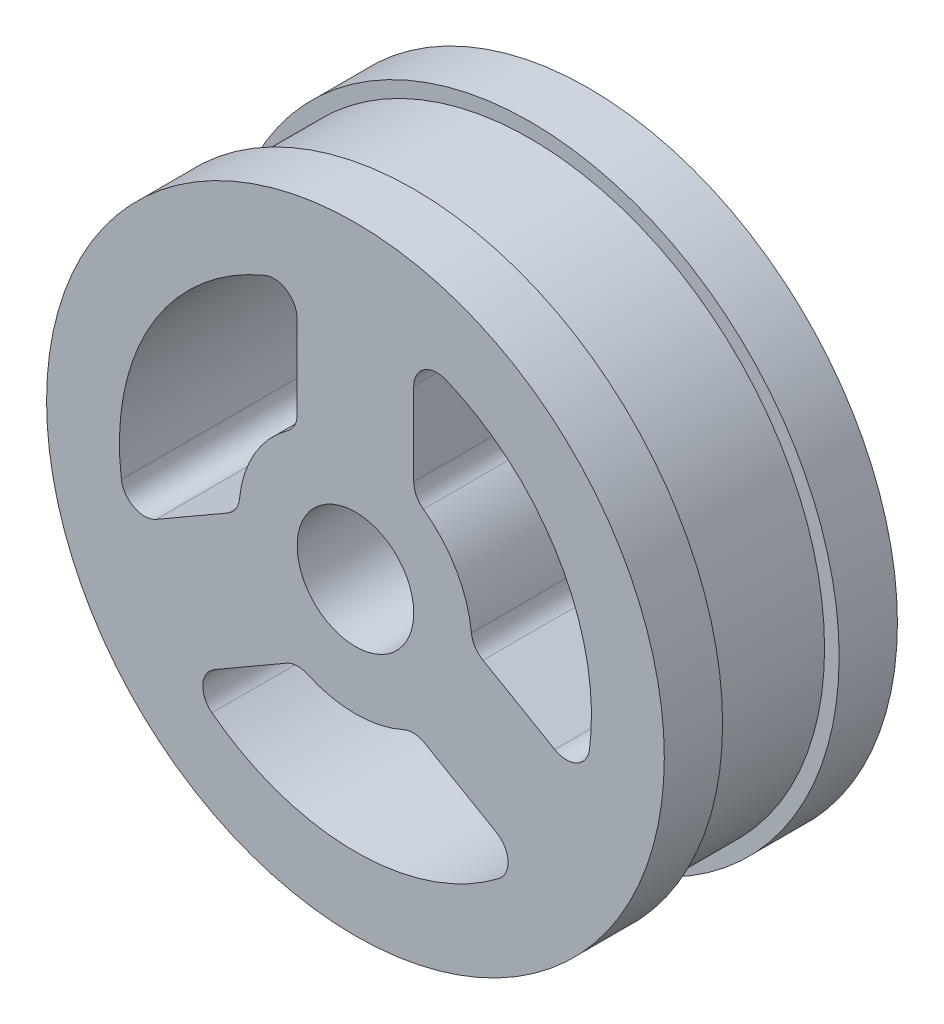
ISO-10303-21;
HEADER;
FILE_DESCRIPTION(('STEP AP214'),'2;1');
FILE_NAME('part.step','',(''),(''),'','','');
FILE_SCHEMA(('AUTOMOTIVE_DESIGN { 1 0 10303 214 1 1 1 1 }'));
ENDSEC;
DATA;
#1=APPLICATION_CONTEXT('core data for automotive mechanical design processes');
#2=APPLICATION_PROTOCOL_DEFINITION('international standard','automotive_design',2000,#1);
#3=PRODUCT_CONTEXT('',#1,'mechanical');
#4=PRODUCT('Part','Part','',(#3));
#5=PRODUCT_RELATED_PRODUCT_CATEGORY('part','',(#4));
#6=PRODUCT_DEFINITION_FORMATION('','',#4);
#7=PRODUCT_DEFINITION_CONTEXT('part definition',#1,'design');
#8=PRODUCT_DEFINITION('design','',#6,#7);
#9=PRODUCT_DEFINITION_SHAPE('','',#8);
#10=(LENGTH_UNIT() NAMED_UNIT(*) SI_UNIT(.MILLI.,.METRE.));
#11=(NAMED_UNIT(*) PLANE_ANGLE_UNIT() SI_UNIT($,.RADIAN.));
#12=(NAMED_UNIT(*) SI_UNIT($,.STERADIAN.) SOLID_ANGLE_UNIT());
#13=UNCERTAINTY_MEASURE_WITH_UNIT(LENGTH_MEASURE(1.E-05),#10,'distance_accuracy_value','');
#14=(GEOMETRIC_REPRESENTATION_CONTEXT(3) GLOBAL_UNCERTAINTY_ASSIGNED_CONTEXT((#13)) GLOBAL_UNIT_ASSIGNED_CONTEXT((#10,
#11,#12)) REPRESENTATION_CONTEXT('',''));
#15=CARTESIAN_POINT('',(0.,0.,0.));
#16=DIRECTION('',(0.,0.,1.));
#17=DIRECTION('',(1.,0.,0.));
#18=AXIS2_PLACEMENT_3D('',#15,#16,#17);
#19=CARTESIAN_POINT('',(0.,0.,0.));
#20=DIRECTION('',(0.,0.,1.));
#21=DIRECTION('',(1.,0.,0.));
#22=AXIS2_PLACEMENT_3D('',#19,#20,#21);
#23=PLANE('',#22);
#24=CARTESIAN_POINT('',(0.,0.,0.));
#25=DIRECTION('',(0.,0.,1.));
#26=DIRECTION('',(1.,0.,0.));
#27=AXIS2_PLACEMENT_3D('',#24,#25,#26);
#28=CIRCLE('',#27,10.);
#29=CARTESIAN_POINT('',(-4.11747625672221,-9.11297916574645,0.));
#30=VERTEX_POINT('',#29);
#31=CARTESIAN_POINT('',(4.11747625672323,-9.11297916574599,0.));
#32=VERTEX_POINT('',#31);
#33=EDGE_CURVE('E226',#30,#32,#28,.T.);
#34=ORIENTED_EDGE('',*,*,#33,.F.);
#35=CARTESIAN_POINT('',(-4.94097150806665,-10.9355749988957,0.));
#36=DIRECTION('',(0.,0.,1.));
#37=DIRECTION('',(1.,0.,0.));
#38=AXIS2_PLACEMENT_3D('',#35,#36,#37);
#39=CIRCLE('',#38,2.);
#40=CARTESIAN_POINT('',(-5.94097150806665,-9.20352419132686,0.));
#41=VERTEX_POINT('',#40);
#42=EDGE_CURVE('E335',#30,#41,#39,.T.);
#43=ORIENTED_EDGE('',*,*,#42,.T.);
#44=DIRECTION('',(-0.866025403784438,-0.5,0.));
#45=VECTOR('',#44,1.);
#46=CARTESIAN_POINT('',(2.50000000000018,-4.33012701892251,0.));
#47=LINE('',#46,#45);
#48=CARTESIAN_POINT('',(-12.0961253420211,-12.757203914264,0.));
#49=VERTEX_POINT('',#48);
#50=EDGE_CURVE('E660',#41,#49,#47,.T.);
#51=ORIENTED_EDGE('',*,*,#50,.T.);
#52=CARTESIAN_POINT('',(-11.0961253420211,-14.4892547218329,0.));
#53=DIRECTION('',(0.,0.,1.));
#54=DIRECTION('',(1.,0.,0.));
#55=AXIS2_PLACEMENT_3D('',#52,#53,#54);
#56=CIRCLE('',#55,2.);
#57=CARTESIAN_POINT('',(-12.312139078133,-16.0771182529927,0.));
#58=VERTEX_POINT('',#57);
#59=EDGE_CURVE('E215',#49,#58,#56,.T.);
#60=ORIENTED_EDGE('',*,*,#59,.T.);
#61=CARTESIAN_POINT('',(0.,0.,0.));
#62=DIRECTION('',(0.,0.,1.));
#63=DIRECTION('',(1.,0.,0.));
#64=AXIS2_PLACEMENT_3D('',#61,#62,#63);
#65=CIRCLE('',#64,20.25);
#66=CARTESIAN_POINT('',(12.3121390781341,-16.0771182529919,0.));
#67=VERTEX_POINT('',#66);
#68=EDGE_CURVE('E656',#58,#67,#65,.T.);
#69=ORIENTED_EDGE('',*,*,#68,.T.);
#70=CARTESIAN_POINT('',(11.0961253420221,-14.4892547218322,0.));
#71=DIRECTION('',(0.,0.,1.));
#72=DIRECTION('',(1.,0.,0.));
#73=AXIS2_PLACEMENT_3D('',#70,#71,#72);
#74=CIRCLE('',#73,2.);
#75=CARTESIAN_POINT('',(12.0961253420221,-12.7572039142633,0.));
#76=VERTEX_POINT('',#75);
#77=EDGE_CURVE('E322',#67,#76,#74,.T.);
#78=ORIENTED_EDGE('',*,*,#77,.T.);
#79=DIRECTION('',(0.866025403784439,-0.5,0.));
#80=VECTOR('',#79,1.);
#81=CARTESIAN_POINT('',(-2.49999999999964,-4.33012701892157,0.));
#82=LINE('',#81,#80);
#83=CARTESIAN_POINT('',(5.94097150806788,-9.20352419132631,0.));
#84=VERTEX_POINT('',#83);
#85=EDGE_CURVE('E422',#84,#76,#82,.T.);
#86=ORIENTED_EDGE('',*,*,#85,.F.);
#87=CARTESIAN_POINT('',(4.94097150806788,-10.9355749988952,0.));
#88=DIRECTION('',(0.,0.,1.));
#89=DIRECTION('',(1.,0.,0.));
#90=AXIS2_PLACEMENT_3D('',#87,#88,#89);
#91=CIRCLE('',#90,2.);
#92=EDGE_CURVE('E214',#84,#32,#91,.T.);
#93=ORIENTED_EDGE('',*,*,#92,.T.);
#94=EDGE_LOOP('',(#34,#43,#51,#60,#69,#78,#86,#93));
#95=FACE_BOUND('',#94,.T.);
#96=CARTESIAN_POINT('',(0.,0.,0.));
#97=DIRECTION('',(0.,0.,1.));
#98=DIRECTION('',(1.,0.,0.));
#99=AXIS2_PLACEMENT_3D('',#96,#97,#98);
#100=CIRCLE('',#99,26.5);
#101=CARTESIAN_POINT('',(26.5,0.,0.));
#102=VERTEX_POINT('',#101);
#103=EDGE_CURVE('E242',#102,#102,#100,.T.);
#104=ORIENTED_EDGE('',*,*,#103,.F.);
#105=EDGE_LOOP('',(#104));
#106=FACE_BOUND('',#105,.T.);
#107=CARTESIAN_POINT('',(0.,0.,0.));
#108=DIRECTION('',(0.,0.,1.));
#109=DIRECTION('',(1.,0.,0.));
#110=AXIS2_PLACEMENT_3D('',#107,#108,#109);
#111=CIRCLE('',#110,5.);
#112=CARTESIAN_POINT('',(5.,0.,0.));
#113=VERTEX_POINT('',#112);
#114=EDGE_CURVE('E430',#113,#113,#111,.T.);
#115=ORIENTED_EDGE('',*,*,#114,.T.);
#116=EDGE_LOOP('',(#115));
#117=FACE_BOUND('',#116,.T.);
#118=CARTESIAN_POINT('',(0.,0.,0.));
#119=DIRECTION('',(0.,0.,1.));
#120=DIRECTION('',(1.,0.,0.));
#121=AXIS2_PLACEMENT_3D('',#118,#119,#120);
#122=CIRCLE('',#121,10.);
#123=CARTESIAN_POINT('',(-5.83333333333333,8.12232862067414,0.));
#124=VERTEX_POINT('',#123);
#125=CARTESIAN_POINT('',(-9.95080959005593,0.990650545071783,0.));
#126=VERTEX_POINT('',#125);
#127=EDGE_CURVE('E416',#124,#126,#122,.T.);
#128=ORIENTED_EDGE('',*,*,#127,.F.);
#129=CARTESIAN_POINT('',(-7.,9.74679434480896,0.));
#130=DIRECTION('',(0.,0.,1.));
#131=DIRECTION('',(1.,0.,0.));
#132=AXIS2_PLACEMENT_3D('',#129,#130,#131);
#133=CIRCLE('',#132,2.);
#134=CARTESIAN_POINT('',(-5.,9.74679434480896,0.));
#135=VERTEX_POINT('',#134);
#136=EDGE_CURVE('E353',#124,#135,#133,.T.);
#137=ORIENTED_EDGE('',*,*,#136,.T.);
#138=DIRECTION('',(0.,1.,0.));
#139=VECTOR('',#138,1.);
#140=CARTESIAN_POINT('',(-5.,0.,0.));
#141=LINE('',#140,#139);
#142=CARTESIAN_POINT('',(-5.,16.8541537906832,0.));
#143=VERTEX_POINT('',#142);
#144=EDGE_CURVE('E404',#135,#143,#141,.T.);
#145=ORIENTED_EDGE('',*,*,#144,.T.);
#146=CARTESIAN_POINT('',(-7.,16.8541537906832,0.));
#147=DIRECTION('',(0.,0.,1.));
#148=DIRECTION('',(1.,0.,0.));
#149=AXIS2_PLACEMENT_3D('',#146,#147,#148);
#150=CIRCLE('',#149,2.);
#151=CARTESIAN_POINT('',(-7.76712328767123,18.7011843430868,0.));
#152=VERTEX_POINT('',#151);
#153=EDGE_CURVE('E11',#143,#152,#150,.T.);
#154=ORIENTED_EDGE('',*,*,#153,.T.);
#155=CARTESIAN_POINT('',(0.,0.,0.));
#156=DIRECTION('',(0.,0.,1.));
#157=DIRECTION('',(1.,0.,0.));
#158=AXIS2_PLACEMENT_3D('',#155,#156,#157);
#159=CIRCLE('',#158,20.25);
#160=CARTESIAN_POINT('',(-20.0792623658045,-2.62406609009485,0.));
#161=VERTEX_POINT('',#160);
#162=EDGE_CURVE('E402',#152,#161,#159,.T.);
#163=ORIENTED_EDGE('',*,*,#162,.T.);
#164=CARTESIAN_POINT('',(-18.0961253420214,-2.36489906885091,0.));
#165=DIRECTION('',(0.,0.,1.));
#166=DIRECTION('',(1.,0.,0.));
#167=AXIS2_PLACEMENT_3D('',#164,#165,#166);
#168=CIRCLE('',#167,2.);
#169=CARTESIAN_POINT('',(-17.0961253420214,-4.09694987641979,0.));
#170=VERTEX_POINT('',#169);
#171=EDGE_CURVE('E341',#161,#170,#168,.T.);
#172=ORIENTED_EDGE('',*,*,#171,.T.);
#173=DIRECTION('',(-0.866025403784438,-0.5,0.));
#174=VECTOR('',#173,1.);
#175=CARTESIAN_POINT('',(-2.49999999999982,4.33012701892188,0.));
#176=LINE('',#175,#174);
#177=CARTESIAN_POINT('',(-10.9409715080671,-0.543270153482737,0.));
#178=VERTEX_POINT('',#177);
#179=EDGE_CURVE('E409',#178,#170,#176,.T.);
#180=ORIENTED_EDGE('',*,*,#179,.F.);
#181=CARTESIAN_POINT('',(-11.9409715080671,1.18878065408614,0.));
#182=DIRECTION('',(0.,0.,1.));
#183=DIRECTION('',(1.,0.,0.));
#184=AXIS2_PLACEMENT_3D('',#181,#182,#183);
#185=CIRCLE('',#184,2.);
#186=EDGE_CURVE('E347',#178,#126,#185,.T.);
#187=ORIENTED_EDGE('',*,*,#186,.T.);
#188=EDGE_LOOP('',(#128,#137,#145,#154,#163,#172,#180,#187));
#189=FACE_BOUND('',#188,.T.);
#190=CARTESIAN_POINT('',(0.,0.,0.));
#191=DIRECTION('',(0.,0.,1.));
#192=DIRECTION('',(1.,0.,0.));
#193=AXIS2_PLACEMENT_3D('',#190,#191,#192);
#194=CIRCLE('',#193,10.);
#195=CARTESIAN_POINT('',(9.95080959005582,0.990650545072899,0.));
#196=VERTEX_POINT('',#195);
#197=CARTESIAN_POINT('',(5.83333333333333,8.12232862067414,0.));
#198=VERTEX_POINT('',#197);
#199=EDGE_CURVE('E566',#196,#198,#194,.T.);
#200=ORIENTED_EDGE('',*,*,#199,.F.);
#201=CARTESIAN_POINT('',(11.940971508067,1.18878065408748,0.));
#202=DIRECTION('',(0.,0.,1.));
#203=DIRECTION('',(1.,0.,0.));
#204=AXIS2_PLACEMENT_3D('',#201,#202,#203);
#205=CIRCLE('',#204,2.);
#206=CARTESIAN_POINT('',(10.940971508067,-0.5432701534814,0.));
#207=VERTEX_POINT('',#206);
#208=EDGE_CURVE('E365',#196,#207,#205,.T.);
#209=ORIENTED_EDGE('',*,*,#208,.T.);
#210=DIRECTION('',(0.866025403784439,-0.5,0.));
#211=VECTOR('',#210,1.);
#212=CARTESIAN_POINT('',(2.50000000000036,4.33012701892282,0.));
#213=LINE('',#212,#211);
#214=CARTESIAN_POINT('',(17.0961253420215,-4.09694987641861,0.));
#215=VERTEX_POINT('',#214);
#216=EDGE_CURVE('E553',#207,#215,#213,.T.);
#217=ORIENTED_EDGE('',*,*,#216,.T.);
#218=CARTESIAN_POINT('',(18.0961253420215,-2.36489906884974,0.));
#219=DIRECTION('',(0.,0.,1.));
#220=DIRECTION('',(1.,0.,0.));
#221=AXIS2_PLACEMENT_3D('',#218,#219,#220);
#222=CIRCLE('',#221,2.);
#223=CARTESIAN_POINT('',(20.0792623658047,-2.62406609009354,0.));
#224=VERTEX_POINT('',#223);
#225=EDGE_CURVE('E376',#215,#224,#222,.T.);
#226=ORIENTED_EDGE('',*,*,#225,.T.);
#227=CARTESIAN_POINT('',(0.,0.,0.));
#228=DIRECTION('',(0.,0.,1.));
#229=DIRECTION('',(1.,0.,0.));
#230=AXIS2_PLACEMENT_3D('',#227,#228,#229);
#231=CIRCLE('',#230,20.25);
#232=CARTESIAN_POINT('',(7.76712328767123,18.7011843430868,0.));
#233=VERTEX_POINT('',#232);
#234=EDGE_CURVE('E550',#224,#233,#231,.T.);
#235=ORIENTED_EDGE('',*,*,#234,.T.);
#236=CARTESIAN_POINT('',(7.,16.8541537906832,0.));
#237=DIRECTION('',(0.,0.,1.));
#238=DIRECTION('',(1.,0.,0.));
#239=AXIS2_PLACEMENT_3D('',#236,#237,#238);
#240=CIRCLE('',#239,2.);
#241=CARTESIAN_POINT('',(5.,16.8541537906832,0.));
#242=VERTEX_POINT('',#241);
#243=EDGE_CURVE('E359',#233,#242,#240,.T.);
#244=ORIENTED_EDGE('',*,*,#243,.T.);
#245=DIRECTION('',(0.,1.,0.));
#246=VECTOR('',#245,1.);
#247=CARTESIAN_POINT('',(5.,0.,0.));
#248=LINE('',#247,#246);
#249=CARTESIAN_POINT('',(5.,9.74679434480896,0.));
#250=VERTEX_POINT('',#249);
#251=EDGE_CURVE('E560',#250,#242,#248,.T.);
#252=ORIENTED_EDGE('',*,*,#251,.F.);
#253=CARTESIAN_POINT('',(7.,9.74679434480896,0.));
#254=DIRECTION('',(0.,0.,1.));
#255=DIRECTION('',(1.,0.,0.));
#256=AXIS2_PLACEMENT_3D('',#253,#254,#255);
#257=CIRCLE('',#256,2.);
#258=EDGE_CURVE('E54',#250,#198,#257,.T.);
#259=ORIENTED_EDGE('',*,*,#258,.T.);
#260=EDGE_LOOP('',(#200,#209,#217,#226,#235,#244,#252,#259));
#261=FACE_BOUND('',#260,.T.);
#262=ADVANCED_FACE('F38',(#95,#106,#117,#189,#261),#23,.F.);
#263=CARTESIAN_POINT('',(0.,0.,20.));
#264=DIRECTION('',(0.,0.,1.));
#265=DIRECTION('',(1.,0.,0.));
#266=AXIS2_PLACEMENT_3D('',#263,#264,#265);
#267=PLANE('',#266);
#268=CARTESIAN_POINT('',(0.,0.,20.));
#269=DIRECTION('',(0.,0.,1.));
#270=DIRECTION('',(1.,0.,0.));
#271=AXIS2_PLACEMENT_3D('',#268,#269,#270);
#272=CIRCLE('',#271,5.);
#273=CARTESIAN_POINT('',(5.,0.,20.));
#274=VERTEX_POINT('',#273);
#275=EDGE_CURVE('E414',#274,#274,#272,.T.);
#276=ORIENTED_EDGE('',*,*,#275,.F.);
#277=EDGE_LOOP('',(#276));
#278=FACE_BOUND('',#277,.T.);
#279=CARTESIAN_POINT('',(0.,0.,20.));
#280=DIRECTION('',(0.,0.,1.));
#281=DIRECTION('',(1.,0.,0.));
#282=AXIS2_PLACEMENT_3D('',#279,#280,#281);
#283=CIRCLE('',#282,26.5);
#284=CARTESIAN_POINT('',(26.5,0.,20.));
#285=VERTEX_POINT('',#284);
#286=EDGE_CURVE('E438',#285,#285,#283,.T.);
#287=ORIENTED_EDGE('',*,*,#286,.T.);
#288=EDGE_LOOP('',(#287));
#289=FACE_BOUND('',#288,.T.);
#290=DIRECTION('',(0.,1.,0.));
#291=VECTOR('',#290,1.);
#292=CARTESIAN_POINT('',(-5.,0.,20.));
#293=LINE('',#292,#291);
#294=CARTESIAN_POINT('',(-5.,9.74679434480896,20.));
#295=VERTEX_POINT('',#294);
#296=CARTESIAN_POINT('',(-5.,16.8541537906832,20.));
#297=VERTEX_POINT('',#296);
#298=EDGE_CURVE('E383',#295,#297,#293,.T.);
#299=ORIENTED_EDGE('',*,*,#298,.F.);
#300=CARTESIAN_POINT('',(-7.,9.74679434480896,20.));
#301=DIRECTION('',(0.,0.,1.));
#302=DIRECTION('',(1.,0.,0.));
#303=AXIS2_PLACEMENT_3D('',#300,#301,#302);
#304=CIRCLE('',#303,2.);
#305=CARTESIAN_POINT('',(-5.83333333333333,8.12232862067414,20.));
#306=VERTEX_POINT('',#305);
#307=EDGE_CURVE('E350',#295,#306,#304,.F.);
#308=ORIENTED_EDGE('',*,*,#307,.T.);
#309=CARTESIAN_POINT('',(0.,0.,20.));
#310=DIRECTION('',(0.,0.,1.));
#311=DIRECTION('',(1.,0.,0.));
#312=AXIS2_PLACEMENT_3D('',#309,#310,#311);
#313=CIRCLE('',#312,10.);
#314=CARTESIAN_POINT('',(-9.95080959005593,0.990650545071783,20.));
#315=VERTEX_POINT('',#314);
#316=EDGE_CURVE('E395',#306,#315,#313,.T.);
#317=ORIENTED_EDGE('',*,*,#316,.T.);
#318=CARTESIAN_POINT('',(-11.9409715080671,1.18878065408614,20.));
#319=DIRECTION('',(0.,0.,1.));
#320=DIRECTION('',(1.,0.,0.));
#321=AXIS2_PLACEMENT_3D('',#318,#319,#320);
#322=CIRCLE('',#321,2.);
#323=CARTESIAN_POINT('',(-10.9409715080671,-0.543270153482737,20.));
#324=VERTEX_POINT('',#323);
#325=EDGE_CURVE('E344',#315,#324,#322,.F.);
#326=ORIENTED_EDGE('',*,*,#325,.T.);
#327=DIRECTION('',(-0.866025403784438,-0.5,0.));
#328=VECTOR('',#327,1.);
#329=CARTESIAN_POINT('',(-2.49999999999982,4.33012701892188,20.));
#330=LINE('',#329,#328);
#331=CARTESIAN_POINT('',(-17.0961253420214,-4.09694987641979,20.));
#332=VERTEX_POINT('',#331);
#333=EDGE_CURVE('E426',#324,#332,#330,.T.);
#334=ORIENTED_EDGE('',*,*,#333,.T.);
#335=CARTESIAN_POINT('',(-18.0961253420214,-2.36489906885091,20.));
#336=DIRECTION('',(0.,0.,1.));
#337=DIRECTION('',(1.,0.,0.));
#338=AXIS2_PLACEMENT_3D('',#335,#336,#337);
#339=CIRCLE('',#338,2.);
#340=CARTESIAN_POINT('',(-20.0792623658045,-2.62406609009485,20.));
#341=VERTEX_POINT('',#340);
#342=EDGE_CURVE('E338',#332,#341,#339,.F.);
#343=ORIENTED_EDGE('',*,*,#342,.T.);
#344=CARTESIAN_POINT('',(0.,0.,20.));
#345=DIRECTION('',(0.,0.,1.));
#346=DIRECTION('',(1.,0.,0.));
#347=AXIS2_PLACEMENT_3D('',#344,#345,#346);
#348=CIRCLE('',#347,20.25);
#349=CARTESIAN_POINT('',(-7.76712328767123,18.7011843430868,20.));
#350=VERTEX_POINT('',#349);
#351=EDGE_CURVE('E385',#350,#341,#348,.T.);
#352=ORIENTED_EDGE('',*,*,#351,.F.);
#353=CARTESIAN_POINT('',(-7.,16.8541537906832,20.));
#354=DIRECTION('',(0.,0.,1.));
#355=DIRECTION('',(1.,0.,0.));
#356=AXIS2_PLACEMENT_3D('',#353,#354,#355);
#357=CIRCLE('',#356,2.);
#358=EDGE_CURVE('E47',#350,#297,#357,.F.);
#359=ORIENTED_EDGE('',*,*,#358,.T.);
#360=EDGE_LOOP('',(#299,#308,#317,#326,#334,#343,#352,#359));
#361=FACE_BOUND('',#360,.T.);
#362=DIRECTION('',(-0.866025403784438,-0.5,0.));
#363=VECTOR('',#362,1.);
#364=CARTESIAN_POINT('',(2.50000000000018,-4.33012701892251,20.));
#365=LINE('',#364,#363);
#366=CARTESIAN_POINT('',(-5.94097150806665,-9.20352419132686,20.));
#367=VERTEX_POINT('',#366);
#368=CARTESIAN_POINT('',(-12.0961253420211,-12.757203914264,20.));
#369=VERTEX_POINT('',#368);
#370=EDGE_CURVE('E648',#367,#369,#365,.T.);
#371=ORIENTED_EDGE('',*,*,#370,.F.);
#372=CARTESIAN_POINT('',(-4.94097150806665,-10.9355749988957,20.));
#373=DIRECTION('',(0.,0.,1.));
#374=DIRECTION('',(1.,0.,0.));
#375=AXIS2_PLACEMENT_3D('',#372,#373,#374);
#376=CIRCLE('',#375,2.);
#377=CARTESIAN_POINT('',(-4.11747625672221,-9.11297916574645,20.));
#378=VERTEX_POINT('',#377);
#379=EDGE_CURVE('E332',#367,#378,#376,.F.);
#380=ORIENTED_EDGE('',*,*,#379,.T.);
#381=CARTESIAN_POINT('',(0.,0.,20.));
#382=DIRECTION('',(0.,0.,1.));
#383=DIRECTION('',(1.,0.,0.));
#384=AXIS2_PLACEMENT_3D('',#381,#382,#383);
#385=CIRCLE('',#384,10.);
#386=CARTESIAN_POINT('',(4.11747625672323,-9.11297916574599,20.));
#387=VERTEX_POINT('',#386);
#388=EDGE_CURVE('E208',#378,#387,#385,.T.);
#389=ORIENTED_EDGE('',*,*,#388,.T.);
#390=CARTESIAN_POINT('',(4.94097150806788,-10.9355749988952,20.));
#391=DIRECTION('',(0.,0.,1.));
#392=DIRECTION('',(1.,0.,0.));
#393=AXIS2_PLACEMENT_3D('',#390,#391,#392);
#394=CIRCLE('',#393,2.);
#395=CARTESIAN_POINT('',(5.94097150806788,-9.20352419132631,20.));
#396=VERTEX_POINT('',#395);
#397=EDGE_CURVE('E201',#387,#396,#394,.F.);
#398=ORIENTED_EDGE('',*,*,#397,.T.);
#399=DIRECTION('',(0.866025403784439,-0.5,0.));
#400=VECTOR('',#399,1.);
#401=CARTESIAN_POINT('',(-2.49999999999964,-4.33012701892157,20.));
#402=LINE('',#401,#400);
#403=CARTESIAN_POINT('',(12.0961253420221,-12.7572039142633,20.));
#404=VERTEX_POINT('',#403);
#405=EDGE_CURVE('E206',#396,#404,#402,.T.);
#406=ORIENTED_EDGE('',*,*,#405,.T.);
#407=CARTESIAN_POINT('',(11.0961253420221,-14.4892547218322,20.));
#408=DIRECTION('',(0.,0.,1.));
#409=DIRECTION('',(1.,0.,0.));
#410=AXIS2_PLACEMENT_3D('',#407,#408,#409);
#411=CIRCLE('',#410,2.);
#412=CARTESIAN_POINT('',(12.3121390781341,-16.0771182529919,20.));
#413=VERTEX_POINT('',#412);
#414=EDGE_CURVE('E319',#404,#413,#411,.F.);
#415=ORIENTED_EDGE('',*,*,#414,.T.);
#416=CARTESIAN_POINT('',(0.,0.,20.));
#417=DIRECTION('',(0.,0.,1.));
#418=DIRECTION('',(1.,0.,0.));
#419=AXIS2_PLACEMENT_3D('',#416,#417,#418);
#420=CIRCLE('',#419,20.25);
#421=CARTESIAN_POINT('',(-12.312139078133,-16.0771182529927,20.));
#422=VERTEX_POINT('',#421);
#423=EDGE_CURVE('E227',#422,#413,#420,.T.);
#424=ORIENTED_EDGE('',*,*,#423,.F.);
#425=CARTESIAN_POINT('',(-11.0961253420211,-14.4892547218329,20.));
#426=DIRECTION('',(0.,0.,1.));
#427=DIRECTION('',(1.,0.,0.));
#428=AXIS2_PLACEMENT_3D('',#425,#426,#427);
#429=CIRCLE('',#428,2.);
#430=EDGE_CURVE('E325',#422,#369,#429,.F.);
#431=ORIENTED_EDGE('',*,*,#430,.T.);
#432=EDGE_LOOP('',(#371,#380,#389,#398,#406,#415,#424,#431));
#433=FACE_BOUND('',#432,.T.);
#434=DIRECTION('',(0.866025403784439,-0.5,0.));
#435=VECTOR('',#434,1.);
#436=CARTESIAN_POINT('',(2.50000000000036,4.33012701892282,20.));
#437=LINE('',#436,#435);
#438=CARTESIAN_POINT('',(10.940971508067,-0.5432701534814,20.));
#439=VERTEX_POINT('',#438);
#440=CARTESIAN_POINT('',(17.0961253420215,-4.09694987641861,20.));
#441=VERTEX_POINT('',#440);
#442=EDGE_CURVE('E574',#439,#441,#437,.T.);
#443=ORIENTED_EDGE('',*,*,#442,.F.);
#444=CARTESIAN_POINT('',(11.940971508067,1.18878065408748,20.));
#445=DIRECTION('',(0.,0.,1.));
#446=DIRECTION('',(1.,0.,0.));
#447=AXIS2_PLACEMENT_3D('',#444,#445,#446);
#448=CIRCLE('',#447,2.);
#449=CARTESIAN_POINT('',(9.95080959005582,0.990650545072899,20.));
#450=VERTEX_POINT('',#449);
#451=EDGE_CURVE('E362',#439,#450,#448,.F.);
#452=ORIENTED_EDGE('',*,*,#451,.T.);
#453=CARTESIAN_POINT('',(0.,0.,20.));
#454=DIRECTION('',(0.,0.,1.));
#455=DIRECTION('',(1.,0.,0.));
#456=AXIS2_PLACEMENT_3D('',#453,#454,#455);
#457=CIRCLE('',#456,10.);
#458=CARTESIAN_POINT('',(5.83333333333333,8.12232862067414,20.));
#459=VERTEX_POINT('',#458);
#460=EDGE_CURVE('E570',#450,#459,#457,.T.);
#461=ORIENTED_EDGE('',*,*,#460,.T.);
#462=CARTESIAN_POINT('',(7.,9.74679434480896,20.));
#463=DIRECTION('',(0.,0.,1.));
#464=DIRECTION('',(1.,0.,0.));
#465=AXIS2_PLACEMENT_3D('',#462,#463,#464);
#466=CIRCLE('',#465,2.);
#467=CARTESIAN_POINT('',(5.,9.74679434480896,20.));
#468=VERTEX_POINT('',#467);
#469=EDGE_CURVE('E368',#459,#468,#466,.F.);
#470=ORIENTED_EDGE('',*,*,#469,.T.);
#471=DIRECTION('',(0.,1.,0.));
#472=VECTOR('',#471,1.);
#473=CARTESIAN_POINT('',(5.,0.,20.));
#474=LINE('',#473,#472);
#475=CARTESIAN_POINT('',(5.,16.8541537906832,20.));
#476=VERTEX_POINT('',#475);
#477=EDGE_CURVE('E581',#468,#476,#474,.T.);
#478=ORIENTED_EDGE('',*,*,#477,.T.);
#479=CARTESIAN_POINT('',(7.,16.8541537906832,20.));
#480=DIRECTION('',(0.,0.,1.));
#481=DIRECTION('',(1.,0.,0.));
#482=AXIS2_PLACEMENT_3D('',#479,#480,#481);
#483=CIRCLE('',#482,2.);
#484=CARTESIAN_POINT('',(7.76712328767123,18.7011843430868,20.));
#485=VERTEX_POINT('',#484);
#486=EDGE_CURVE('E356',#476,#485,#483,.F.);
#487=ORIENTED_EDGE('',*,*,#486,.T.);
#488=CARTESIAN_POINT('',(0.,0.,20.));
#489=DIRECTION('',(0.,0.,1.));
#490=DIRECTION('',(1.,0.,0.));
#491=AXIS2_PLACEMENT_3D('',#488,#489,#490);
#492=CIRCLE('',#491,20.25);
#493=CARTESIAN_POINT('',(20.0792623658047,-2.62406609009354,20.));
#494=VERTEX_POINT('',#493);
#495=EDGE_CURVE('E578',#494,#485,#492,.T.);
#496=ORIENTED_EDGE('',*,*,#495,.F.);
#497=CARTESIAN_POINT('',(18.0961253420215,-2.36489906884974,20.));
#498=DIRECTION('',(0.,0.,1.));
#499=DIRECTION('',(1.,0.,0.));
#500=AXIS2_PLACEMENT_3D('',#497,#498,#499);
#501=CIRCLE('',#500,2.);
#502=EDGE_CURVE('E373',#494,#441,#501,.F.);
#503=ORIENTED_EDGE('',*,*,#502,.T.);
#504=EDGE_LOOP('',(#443,#452,#461,#470,#478,#487,#496,#503));
#505=FACE_BOUND('',#504,.T.);
#506=ADVANCED_FACE('F204',(#278,#289,#361,#433,#505),#267,.T.);
#507=CARTESIAN_POINT('',(0.,0.,5.));
#508=DIRECTION('',(0.,0.,-1.));
#509=DIRECTION('',(-1.,0.,0.));
#510=AXIS2_PLACEMENT_3D('',#507,#508,#509);
#511=CYLINDRICAL_SURFACE('',#510,26.5);
#512=CARTESIAN_POINT('',(0.,0.,5.));
#513=DIRECTION('',(0.,0.,1.));
#514=DIRECTION('',(1.,0.,0.));
#515=AXIS2_PLACEMENT_3D('',#512,#513,#514);
#516=CIRCLE('',#515,26.5);
#517=CARTESIAN_POINT('',(26.5,0.,5.));
#518=VERTEX_POINT('',#517);
#519=EDGE_CURVE('E239',#518,#518,#516,.T.);
#520=ORIENTED_EDGE('',*,*,#519,.F.);
#521=EDGE_LOOP('',(#520));
#522=FACE_BOUND('',#521,.T.);
#523=ORIENTED_EDGE('',*,*,#103,.T.);
#524=EDGE_LOOP('',(#523));
#525=FACE_BOUND('',#524,.T.);
#526=ADVANCED_FACE('F456',(#522,#525),#511,.T.);
#527=CARTESIAN_POINT('',(0.,0.,5.));
#528=DIRECTION('',(0.,0.,1.));
#529=DIRECTION('',(1.,0.,0.));
#530=AXIS2_PLACEMENT_3D('',#527,#528,#529);
#531=PLANE('',#530);
#532=CARTESIAN_POINT('',(0.,0.,5.));
#533=DIRECTION('',(0.,0.,1.));
#534=DIRECTION('',(1.,0.,0.));
#535=AXIS2_PLACEMENT_3D('',#532,#533,#534);
#536=CIRCLE('',#535,25.25);
#537=CARTESIAN_POINT('',(25.25,0.,5.));
#538=VERTEX_POINT('',#537);
#539=EDGE_CURVE('E232',#538,#538,#536,.T.);
#540=ORIENTED_EDGE('',*,*,#539,.F.);
#541=EDGE_LOOP('',(#540));
#542=FACE_BOUND('',#541,.T.);
#543=ORIENTED_EDGE('',*,*,#519,.T.);
#544=EDGE_LOOP('',(#543));
#545=FACE_BOUND('',#544,.T.);
#546=ADVANCED_FACE('F492',(#542,#545),#531,.T.);
#547=CARTESIAN_POINT('',(0.,0.,15.));
#548=DIRECTION('',(0.,0.,-1.));
#549=DIRECTION('',(-1.,0.,0.));
#550=AXIS2_PLACEMENT_3D('',#547,#548,#549);
#551=CYLINDRICAL_SURFACE('',#550,25.25);
#552=CARTESIAN_POINT('',(0.,0.,15.));
#553=DIRECTION('',(0.,0.,1.));
#554=DIRECTION('',(1.,0.,0.));
#555=AXIS2_PLACEMENT_3D('',#552,#553,#554);
#556=CIRCLE('',#555,25.25);
#557=CARTESIAN_POINT('',(25.25,0.,15.));
#558=VERTEX_POINT('',#557);
#559=EDGE_CURVE('E442',#558,#558,#556,.T.);
#560=ORIENTED_EDGE('',*,*,#559,.F.);
#561=EDGE_LOOP('',(#560));
#562=FACE_BOUND('',#561,.T.);
#563=ORIENTED_EDGE('',*,*,#539,.T.);
#564=EDGE_LOOP('',(#563));
#565=FACE_BOUND('',#564,.T.);
#566=ADVANCED_FACE('F480',(#562,#565),#551,.T.);
#567=CARTESIAN_POINT('',(0.,0.,20.));
#568=DIRECTION('',(0.,0.,-1.));
#569=DIRECTION('',(-1.,0.,0.));
#570=AXIS2_PLACEMENT_3D('',#567,#568,#569);
#571=CYLINDRICAL_SURFACE('',#570,26.5);
#572=ORIENTED_EDGE('',*,*,#286,.F.);
#573=EDGE_LOOP('',(#572));
#574=FACE_BOUND('',#573,.T.);
#575=CARTESIAN_POINT('',(0.,0.,15.));
#576=DIRECTION('',(0.,0.,1.));
#577=DIRECTION('',(1.,0.,0.));
#578=AXIS2_PLACEMENT_3D('',#575,#576,#577);
#579=CIRCLE('',#578,26.5);
#580=CARTESIAN_POINT('',(26.5,0.,15.));
#581=VERTEX_POINT('',#580);
#582=EDGE_CURVE('E434',#581,#581,#579,.T.);
#583=ORIENTED_EDGE('',*,*,#582,.T.);
#584=EDGE_LOOP('',(#583));
#585=FACE_BOUND('',#584,.T.);
#586=ADVANCED_FACE('F477',(#574,#585),#571,.T.);
#587=CARTESIAN_POINT('',(0.,0.,15.));
#588=DIRECTION('',(0.,0.,1.));
#589=DIRECTION('',(1.,0.,0.));
#590=AXIS2_PLACEMENT_3D('',#587,#588,#589);
#591=PLANE('',#590);
#592=ORIENTED_EDGE('',*,*,#559,.T.);
#593=EDGE_LOOP('',(#592));
#594=FACE_BOUND('',#593,.T.);
#595=ORIENTED_EDGE('',*,*,#582,.F.);
#596=EDGE_LOOP('',(#595));
#597=FACE_BOUND('',#596,.T.);
#598=ADVANCED_FACE('F468',(#594,#597),#591,.F.);
#599=CARTESIAN_POINT('',(0.,0.,0.));
#600=DIRECTION('',(0.,0.,1.));
#601=DIRECTION('',(1.,0.,0.));
#602=AXIS2_PLACEMENT_3D('',#599,#600,#601);
#603=CYLINDRICAL_SURFACE('',#602,5.);
#604=ORIENTED_EDGE('',*,*,#114,.F.);
#605=EDGE_LOOP('',(#604));
#606=FACE_BOUND('',#605,.T.);
#607=ORIENTED_EDGE('',*,*,#275,.T.);
#608=EDGE_LOOP('',(#607));
#609=FACE_BOUND('',#608,.T.);
#610=ADVANCED_FACE('F464',(#606,#609),#603,.F.);
#611=CARTESIAN_POINT('',(0.,0.,0.));
#612=DIRECTION('',(0.,0.,1.));
#613=DIRECTION('',(1.,0.,0.));
#614=AXIS2_PLACEMENT_3D('',#611,#612,#613);
#615=CYLINDRICAL_SURFACE('',#614,10.);
#616=ORIENTED_EDGE('',*,*,#127,.T.);
#617=DIRECTION('',(0.,0.,1.));
#618=VECTOR('',#617,1.);
#619=CARTESIAN_POINT('',(-9.95080959005593,0.990650545071783,0.));
#620=LINE('',#619,#618);
#621=EDGE_CURVE('E281',#126,#315,#620,.T.);
#622=ORIENTED_EDGE('',*,*,#621,.T.);
#623=ORIENTED_EDGE('',*,*,#316,.F.);
#624=DIRECTION('',(0.,0.,1.));
#625=VECTOR('',#624,1.);
#626=CARTESIAN_POINT('',(-5.83333333333333,8.12232862067414,0.));
#627=LINE('',#626,#625);
#628=EDGE_CURVE('E278',#306,#124,#627,.F.);
#629=ORIENTED_EDGE('',*,*,#628,.T.);
#630=EDGE_LOOP('',(#616,#622,#623,#629));
#631=FACE_BOUND('',#630,.T.);
#632=ADVANCED_FACE('F467',(#631),#615,.T.);
#633=CARTESIAN_POINT('',(-2.49999999999982,4.33012701892188,0.));
#634=DIRECTION('',(-0.5,0.866025403784438,0.));
#635=DIRECTION('',(-0.866025403784438,-0.5,0.));
#636=AXIS2_PLACEMENT_3D('',#633,#634,#635);
#637=PLANE('',#636);
#638=ORIENTED_EDGE('',*,*,#179,.T.);
#639=DIRECTION('',(0.,0.,1.));
#640=VECTOR('',#639,1.);
#641=CARTESIAN_POINT('',(-17.0961253420214,-4.09694987641979,0.));
#642=LINE('',#641,#640);
#643=EDGE_CURVE('E267',#170,#332,#642,.T.);
#644=ORIENTED_EDGE('',*,*,#643,.T.);
#645=ORIENTED_EDGE('',*,*,#333,.F.);
#646=DIRECTION('',(0.,0.,-1.));
#647=VECTOR('',#646,1.);
#648=CARTESIAN_POINT('',(-10.9409715080671,-0.543270153482739,0.));
#649=LINE('',#648,#647);
#650=EDGE_CURVE('E264',#324,#178,#649,.T.);
#651=ORIENTED_EDGE('',*,*,#650,.T.);
#652=EDGE_LOOP('',(#638,#644,#645,#651));
#653=FACE_BOUND('',#652,.T.);
#654=ADVANCED_FACE('F595',(#653),#637,.T.);
#655=CARTESIAN_POINT('',(0.,0.,0.));
#656=DIRECTION('',(0.,0.,1.));
#657=DIRECTION('',(1.,0.,0.));
#658=AXIS2_PLACEMENT_3D('',#655,#656,#657);
#659=CYLINDRICAL_SURFACE('',#658,20.25);
#660=ORIENTED_EDGE('',*,*,#351,.T.);
#661=DIRECTION('',(0.,0.,1.));
#662=VECTOR('',#661,1.);
#663=CARTESIAN_POINT('',(-20.0792623658045,-2.62406609009485,0.));
#664=LINE('',#663,#662);
#665=EDGE_CURVE('E275',#341,#161,#664,.F.);
#666=ORIENTED_EDGE('',*,*,#665,.T.);
#667=ORIENTED_EDGE('',*,*,#162,.F.);
#668=DIRECTION('',(0.,0.,1.));
#669=VECTOR('',#668,1.);
#670=CARTESIAN_POINT('',(-7.76712328767123,18.7011843430868,0.));
#671=LINE('',#670,#669);
#672=EDGE_CURVE('E271',#152,#350,#671,.T.);
#673=ORIENTED_EDGE('',*,*,#672,.T.);
#674=EDGE_LOOP('',(#660,#666,#667,#673));
#675=FACE_BOUND('',#674,.T.);
#676=ADVANCED_FACE('F406',(#675),#659,.F.);
#677=CARTESIAN_POINT('',(-5.,0.,0.));
#678=DIRECTION('',(1.,0.,0.));
#679=DIRECTION('',(0.,1.,0.));
#680=AXIS2_PLACEMENT_3D('',#677,#678,#679);
#681=PLANE('',#680);
#682=ORIENTED_EDGE('',*,*,#144,.F.);
#683=DIRECTION('',(0.,0.,1.));
#684=VECTOR('',#683,1.);
#685=CARTESIAN_POINT('',(-5.,9.74679434480896,0.));
#686=LINE('',#685,#684);
#687=EDGE_CURVE('E288',#135,#295,#686,.T.);
#688=ORIENTED_EDGE('',*,*,#687,.T.);
#689=ORIENTED_EDGE('',*,*,#298,.T.);
#690=DIRECTION('',(0.,0.,-1.));
#691=VECTOR('',#690,1.);
#692=CARTESIAN_POINT('',(-5.,16.8541537906832,0.));
#693=LINE('',#692,#691);
#694=EDGE_CURVE('E285',#297,#143,#693,.T.);
#695=ORIENTED_EDGE('',*,*,#694,.T.);
#696=EDGE_LOOP('',(#682,#688,#689,#695));
#697=FACE_BOUND('',#696,.T.);
#698=ADVANCED_FACE('F391',(#697),#681,.F.);
#699=CARTESIAN_POINT('',(0.,0.,0.));
#700=DIRECTION('',(0.,0.,1.));
#701=DIRECTION('',(1.,0.,0.));
#702=AXIS2_PLACEMENT_3D('',#699,#700,#701);
#703=CYLINDRICAL_SURFACE('',#702,10.);
#704=ORIENTED_EDGE('',*,*,#33,.T.);
#705=DIRECTION('',(0.,0.,1.));
#706=VECTOR('',#705,1.);
#707=CARTESIAN_POINT('',(4.11747625672323,-9.11297916574599,0.));
#708=LINE('',#707,#706);
#709=EDGE_CURVE('E261',#32,#387,#708,.T.);
#710=ORIENTED_EDGE('',*,*,#709,.T.);
#711=ORIENTED_EDGE('',*,*,#388,.F.);
#712=DIRECTION('',(0.,0.,1.));
#713=VECTOR('',#712,1.);
#714=CARTESIAN_POINT('',(-4.11747625672221,-9.11297916574645,0.));
#715=LINE('',#714,#713);
#716=EDGE_CURVE('E258',#378,#30,#715,.F.);
#717=ORIENTED_EDGE('',*,*,#716,.T.);
#718=EDGE_LOOP('',(#704,#710,#711,#717));
#719=FACE_BOUND('',#718,.T.);
#720=ADVANCED_FACE('F611',(#719),#703,.T.);
#721=CARTESIAN_POINT('',(-2.49999999999964,-4.33012701892157,0.));
#722=DIRECTION('',(-0.5,-0.866025403784439,0.));
#723=DIRECTION('',(0.866025403784439,-0.5,0.));
#724=AXIS2_PLACEMENT_3D('',#721,#722,#723);
#725=PLANE('',#724);
#726=ORIENTED_EDGE('',*,*,#85,.T.);
#727=DIRECTION('',(0.,0.,1.));
#728=VECTOR('',#727,1.);
#729=CARTESIAN_POINT('',(12.0961253420221,-12.7572039142633,0.));
#730=LINE('',#729,#728);
#731=EDGE_CURVE('E224',#76,#404,#730,.T.);
#732=ORIENTED_EDGE('',*,*,#731,.T.);
#733=ORIENTED_EDGE('',*,*,#405,.F.);
#734=DIRECTION('',(0.,0.,-1.));
#735=VECTOR('',#734,1.);
#736=CARTESIAN_POINT('',(5.94097150806788,-9.20352419132631,0.));
#737=LINE('',#736,#735);
#738=EDGE_CURVE('E221',#396,#84,#737,.T.);
#739=ORIENTED_EDGE('',*,*,#738,.T.);
#740=EDGE_LOOP('',(#726,#732,#733,#739));
#741=FACE_BOUND('',#740,.T.);
#742=ADVANCED_FACE('F220',(#741),#725,.T.);
#743=CARTESIAN_POINT('',(0.,0.,0.));
#744=DIRECTION('',(0.,0.,1.));
#745=DIRECTION('',(1.,0.,0.));
#746=AXIS2_PLACEMENT_3D('',#743,#744,#745);
#747=CYLINDRICAL_SURFACE('',#746,20.25);
#748=ORIENTED_EDGE('',*,*,#423,.T.);
#749=DIRECTION('',(0.,0.,1.));
#750=VECTOR('',#749,1.);
#751=CARTESIAN_POINT('',(12.3121390781341,-16.0771182529919,0.));
#752=LINE('',#751,#750);
#753=EDGE_CURVE('E248',#413,#67,#752,.F.);
#754=ORIENTED_EDGE('',*,*,#753,.T.);
#755=ORIENTED_EDGE('',*,*,#68,.F.);
#756=DIRECTION('',(0.,0.,1.));
#757=VECTOR('',#756,1.);
#758=CARTESIAN_POINT('',(-12.312139078133,-16.0771182529927,0.));
#759=LINE('',#758,#757);
#760=EDGE_CURVE('E236',#58,#422,#759,.T.);
#761=ORIENTED_EDGE('',*,*,#760,.T.);
#762=EDGE_LOOP('',(#748,#754,#755,#761));
#763=FACE_BOUND('',#762,.T.);
#764=ADVANCED_FACE('F620',(#763),#747,.F.);
#765=CARTESIAN_POINT('',(2.50000000000018,-4.33012701892251,0.));
#766=DIRECTION('',(-0.5,0.866025403784438,0.));
#767=DIRECTION('',(-0.866025403784438,-0.5,0.));
#768=AXIS2_PLACEMENT_3D('',#765,#766,#767);
#769=PLANE('',#768);
#770=ORIENTED_EDGE('',*,*,#370,.T.);
#771=DIRECTION('',(0.,0.,-1.));
#772=VECTOR('',#771,1.);
#773=CARTESIAN_POINT('',(-12.0961253420211,-12.757203914264,0.));
#774=LINE('',#773,#772);
#775=EDGE_CURVE('E255',#369,#49,#774,.T.);
#776=ORIENTED_EDGE('',*,*,#775,.T.);
#777=ORIENTED_EDGE('',*,*,#50,.F.);
#778=DIRECTION('',(0.,0.,1.));
#779=VECTOR('',#778,1.);
#780=CARTESIAN_POINT('',(-5.94097150806665,-9.20352419132686,0.));
#781=LINE('',#780,#779);
#782=EDGE_CURVE('E251',#41,#367,#781,.T.);
#783=ORIENTED_EDGE('',*,*,#782,.T.);
#784=EDGE_LOOP('',(#770,#776,#777,#783));
#785=FACE_BOUND('',#784,.T.);
#786=ADVANCED_FACE('F625',(#785),#769,.F.);
#787=CARTESIAN_POINT('',(0.,0.,0.));
#788=DIRECTION('',(0.,0.,1.));
#789=DIRECTION('',(1.,0.,0.));
#790=AXIS2_PLACEMENT_3D('',#787,#788,#789);
#791=CYLINDRICAL_SURFACE('',#790,10.);
#792=ORIENTED_EDGE('',*,*,#460,.F.);
#793=DIRECTION('',(0.,0.,1.));
#794=VECTOR('',#793,1.);
#795=CARTESIAN_POINT('',(9.95080959005582,0.990650545072899,0.));
#796=LINE('',#795,#794);
#797=EDGE_CURVE('E61',#450,#196,#796,.F.);
#798=ORIENTED_EDGE('',*,*,#797,.T.);
#799=ORIENTED_EDGE('',*,*,#199,.T.);
#800=DIRECTION('',(0.,0.,1.));
#801=VECTOR('',#800,1.);
#802=CARTESIAN_POINT('',(5.83333333333333,8.12232862067414,0.));
#803=LINE('',#802,#801);
#804=EDGE_CURVE('E313',#198,#459,#803,.T.);
#805=ORIENTED_EDGE('',*,*,#804,.T.);
#806=EDGE_LOOP('',(#792,#798,#799,#805));
#807=FACE_BOUND('',#806,.T.);
#808=ADVANCED_FACE('F607',(#807),#791,.T.);
#809=CARTESIAN_POINT('',(5.,0.,0.));
#810=DIRECTION('',(1.,0.,0.));
#811=DIRECTION('',(0.,1.,0.));
#812=AXIS2_PLACEMENT_3D('',#809,#810,#811);
#813=PLANE('',#812);
#814=ORIENTED_EDGE('',*,*,#251,.T.);
#815=DIRECTION('',(0.,0.,1.));
#816=VECTOR('',#815,1.);
#817=CARTESIAN_POINT('',(5.,16.8541537906832,0.));
#818=LINE('',#817,#816);
#819=EDGE_CURVE('E295',#242,#476,#818,.T.);
#820=ORIENTED_EDGE('',*,*,#819,.T.);
#821=ORIENTED_EDGE('',*,*,#477,.F.);
#822=DIRECTION('',(0.,0.,-1.));
#823=VECTOR('',#822,1.);
#824=CARTESIAN_POINT('',(5.,9.74679434480896,0.));
#825=LINE('',#824,#823);
#826=EDGE_CURVE('E292',#468,#250,#825,.T.);
#827=ORIENTED_EDGE('',*,*,#826,.T.);
#828=EDGE_LOOP('',(#814,#820,#821,#827));
#829=FACE_BOUND('',#828,.T.);
#830=ADVANCED_FACE('F627',(#829),#813,.T.);
#831=CARTESIAN_POINT('',(0.,0.,0.));
#832=DIRECTION('',(0.,0.,1.));
#833=DIRECTION('',(1.,0.,0.));
#834=AXIS2_PLACEMENT_3D('',#831,#832,#833);
#835=CYLINDRICAL_SURFACE('',#834,20.25);
#836=ORIENTED_EDGE('',*,*,#495,.T.);
#837=DIRECTION('',(0.,0.,1.));
#838=VECTOR('',#837,1.);
#839=CARTESIAN_POINT('',(7.76712328767123,18.7011843430868,0.));
#840=LINE('',#839,#838);
#841=EDGE_CURVE('E303',#485,#233,#840,.F.);
#842=ORIENTED_EDGE('',*,*,#841,.T.);
#843=ORIENTED_EDGE('',*,*,#234,.F.);
#844=DIRECTION('',(0.,0.,1.));
#845=VECTOR('',#844,1.);
#846=CARTESIAN_POINT('',(20.0792623658047,-2.62406609009354,0.));
#847=LINE('',#846,#845);
#848=EDGE_CURVE('E299',#224,#494,#847,.T.);
#849=ORIENTED_EDGE('',*,*,#848,.T.);
#850=EDGE_LOOP('',(#836,#842,#843,#849));
#851=FACE_BOUND('',#850,.T.);
#852=ADVANCED_FACE('F556',(#851),#835,.F.);
#853=CARTESIAN_POINT('',(2.50000000000036,4.33012701892282,0.));
#854=DIRECTION('',(-0.5,-0.866025403784439,0.));
#855=DIRECTION('',(0.866025403784439,-0.5,0.));
#856=AXIS2_PLACEMENT_3D('',#853,#854,#855);
#857=PLANE('',#856);
#858=ORIENTED_EDGE('',*,*,#216,.F.);
#859=DIRECTION('',(0.,0.,1.));
#860=VECTOR('',#859,1.);
#861=CARTESIAN_POINT('',(10.940971508067,-0.543270153481399,0.));
#862=LINE('',#861,#860);
#863=EDGE_CURVE('E309',#207,#439,#862,.T.);
#864=ORIENTED_EDGE('',*,*,#863,.T.);
#865=ORIENTED_EDGE('',*,*,#442,.T.);
#866=DIRECTION('',(0.,0.,-1.));
#867=VECTOR('',#866,1.);
#868=CARTESIAN_POINT('',(17.0961253420215,-4.09694987641861,0.));
#869=LINE('',#868,#867);
#870=EDGE_CURVE('E306',#441,#215,#869,.T.);
#871=ORIENTED_EDGE('',*,*,#870,.T.);
#872=EDGE_LOOP('',(#858,#864,#865,#871));
#873=FACE_BOUND('',#872,.T.);
#874=ADVANCED_FACE('F504',(#873),#857,.F.);
#875=CARTESIAN_POINT('',(11.0961253420221,-14.4892547218322,0.));
#876=DIRECTION('',(0.,0.,1.));
#877=DIRECTION('',(1.,0.,0.));
#878=AXIS2_PLACEMENT_3D('',#875,#876,#877);
#879=CYLINDRICAL_SURFACE('',#878,2.);
#880=ORIENTED_EDGE('',*,*,#77,.F.);
#881=ORIENTED_EDGE('',*,*,#753,.F.);
#882=ORIENTED_EDGE('',*,*,#414,.F.);
#883=ORIENTED_EDGE('',*,*,#731,.F.);
#884=EDGE_LOOP('',(#880,#881,#882,#883));
#885=FACE_BOUND('',#884,.T.);
#886=ADVANCED_FACE('F500',(#885),#879,.F.);
#887=CARTESIAN_POINT('',(-11.0961253420211,-14.4892547218329,0.));
#888=DIRECTION('',(0.,0.,1.));
#889=DIRECTION('',(1.,0.,0.));
#890=AXIS2_PLACEMENT_3D('',#887,#888,#889);
#891=CYLINDRICAL_SURFACE('',#890,2.);
#892=ORIENTED_EDGE('',*,*,#59,.F.);
#893=ORIENTED_EDGE('',*,*,#775,.F.);
#894=ORIENTED_EDGE('',*,*,#430,.F.);
#895=ORIENTED_EDGE('',*,*,#760,.F.);
#896=EDGE_LOOP('',(#892,#893,#894,#895));
#897=FACE_BOUND('',#896,.T.);
#898=ADVANCED_FACE('F503',(#897),#891,.F.);
#899=CARTESIAN_POINT('',(4.94097150806788,-10.9355749988952,0.));
#900=DIRECTION('',(0.,0.,1.));
#901=DIRECTION('',(1.,0.,0.));
#902=AXIS2_PLACEMENT_3D('',#899,#900,#901);
#903=CYLINDRICAL_SURFACE('',#902,2.);
#904=ORIENTED_EDGE('',*,*,#92,.F.);
#905=ORIENTED_EDGE('',*,*,#738,.F.);
#906=ORIENTED_EDGE('',*,*,#397,.F.);
#907=ORIENTED_EDGE('',*,*,#709,.F.);
#908=EDGE_LOOP('',(#904,#905,#906,#907));
#909=FACE_BOUND('',#908,.T.);
#910=ADVANCED_FACE('F230',(#909),#903,.F.);
#911=CARTESIAN_POINT('',(-4.94097150806665,-10.9355749988957,0.));
#912=DIRECTION('',(0.,0.,1.));
#913=DIRECTION('',(1.,0.,0.));
#914=AXIS2_PLACEMENT_3D('',#911,#912,#913);
#915=CYLINDRICAL_SURFACE('',#914,2.);
#916=ORIENTED_EDGE('',*,*,#42,.F.);
#917=ORIENTED_EDGE('',*,*,#716,.F.);
#918=ORIENTED_EDGE('',*,*,#379,.F.);
#919=ORIENTED_EDGE('',*,*,#782,.F.);
#920=EDGE_LOOP('',(#916,#917,#918,#919));
#921=FACE_BOUND('',#920,.T.);
#922=ADVANCED_FACE('F511',(#921),#915,.F.);
#923=CARTESIAN_POINT('',(-18.0961253420214,-2.36489906885091,0.));
#924=DIRECTION('',(0.,0.,1.));
#925=DIRECTION('',(1.,0.,0.));
#926=AXIS2_PLACEMENT_3D('',#923,#924,#925);
#927=CYLINDRICAL_SURFACE('',#926,2.);
#928=ORIENTED_EDGE('',*,*,#171,.F.);
#929=ORIENTED_EDGE('',*,*,#665,.F.);
#930=ORIENTED_EDGE('',*,*,#342,.F.);
#931=ORIENTED_EDGE('',*,*,#643,.F.);
#932=EDGE_LOOP('',(#928,#929,#930,#931));
#933=FACE_BOUND('',#932,.T.);
#934=ADVANCED_FACE('F514',(#933),#927,.F.);
#935=CARTESIAN_POINT('',(-11.9409715080671,1.18878065408614,0.));
#936=DIRECTION('',(0.,0.,1.));
#937=DIRECTION('',(1.,0.,0.));
#938=AXIS2_PLACEMENT_3D('',#935,#936,#937);
#939=CYLINDRICAL_SURFACE('',#938,2.);
#940=ORIENTED_EDGE('',*,*,#186,.F.);
#941=ORIENTED_EDGE('',*,*,#650,.F.);
#942=ORIENTED_EDGE('',*,*,#325,.F.);
#943=ORIENTED_EDGE('',*,*,#621,.F.);
#944=EDGE_LOOP('',(#940,#941,#942,#943));
#945=FACE_BOUND('',#944,.T.);
#946=ADVANCED_FACE('F518',(#945),#939,.F.);
#947=CARTESIAN_POINT('',(-7.,9.74679434480896,0.));
#948=DIRECTION('',(0.,0.,1.));
#949=DIRECTION('',(1.,0.,0.));
#950=AXIS2_PLACEMENT_3D('',#947,#948,#949);
#951=CYLINDRICAL_SURFACE('',#950,2.);
#952=ORIENTED_EDGE('',*,*,#136,.F.);
#953=ORIENTED_EDGE('',*,*,#628,.F.);
#954=ORIENTED_EDGE('',*,*,#307,.F.);
#955=ORIENTED_EDGE('',*,*,#687,.F.);
#956=EDGE_LOOP('',(#952,#953,#954,#955));
#957=FACE_BOUND('',#956,.T.);
#958=ADVANCED_FACE('F522',(#957),#951,.F.);
#959=CARTESIAN_POINT('',(7.,16.8541537906832,0.));
#960=DIRECTION('',(0.,0.,1.));
#961=DIRECTION('',(1.,0.,0.));
#962=AXIS2_PLACEMENT_3D('',#959,#960,#961);
#963=CYLINDRICAL_SURFACE('',#962,2.);
#964=ORIENTED_EDGE('',*,*,#243,.F.);
#965=ORIENTED_EDGE('',*,*,#841,.F.);
#966=ORIENTED_EDGE('',*,*,#486,.F.);
#967=ORIENTED_EDGE('',*,*,#819,.F.);
#968=EDGE_LOOP('',(#964,#965,#966,#967));
#969=FACE_BOUND('',#968,.T.);
#970=ADVANCED_FACE('F526',(#969),#963,.F.);
#971=CARTESIAN_POINT('',(11.940971508067,1.18878065408748,0.));
#972=DIRECTION('',(0.,0.,1.));
#973=DIRECTION('',(1.,0.,0.));
#974=AXIS2_PLACEMENT_3D('',#971,#972,#973);
#975=CYLINDRICAL_SURFACE('',#974,2.);
#976=ORIENTED_EDGE('',*,*,#208,.F.);
#977=ORIENTED_EDGE('',*,*,#797,.F.);
#978=ORIENTED_EDGE('',*,*,#451,.F.);
#979=ORIENTED_EDGE('',*,*,#863,.F.);
#980=EDGE_LOOP('',(#976,#977,#978,#979));
#981=FACE_BOUND('',#980,.T.);
#982=ADVANCED_FACE('F530',(#981),#975,.F.);
#983=CARTESIAN_POINT('',(7.,9.74679434480896,0.));
#984=DIRECTION('',(0.,0.,1.));
#985=DIRECTION('',(1.,0.,0.));
#986=AXIS2_PLACEMENT_3D('',#983,#984,#985);
#987=CYLINDRICAL_SURFACE('',#986,2.);
#988=ORIENTED_EDGE('',*,*,#258,.F.);
#989=ORIENTED_EDGE('',*,*,#826,.F.);
#990=ORIENTED_EDGE('',*,*,#469,.F.);
#991=ORIENTED_EDGE('',*,*,#804,.F.);
#992=EDGE_LOOP('',(#988,#989,#990,#991));
#993=FACE_BOUND('',#992,.T.);
#994=ADVANCED_FACE('F534',(#993),#987,.F.);
#995=CARTESIAN_POINT('',(18.0961253420215,-2.36489906884974,0.));
#996=DIRECTION('',(0.,0.,1.));
#997=DIRECTION('',(1.,0.,0.));
#998=AXIS2_PLACEMENT_3D('',#995,#996,#997);
#999=CYLINDRICAL_SURFACE('',#998,2.);
#1000=ORIENTED_EDGE('',*,*,#225,.F.);
#1001=ORIENTED_EDGE('',*,*,#870,.F.);
#1002=ORIENTED_EDGE('',*,*,#502,.F.);
#1003=ORIENTED_EDGE('',*,*,#848,.F.);
#1004=EDGE_LOOP('',(#1000,#1001,#1002,#1003));
#1005=FACE_BOUND('',#1004,.T.);
#1006=ADVANCED_FACE('F537',(#1005),#999,.F.);
#1007=CARTESIAN_POINT('',(-7.,16.8541537906832,0.));
#1008=DIRECTION('',(0.,0.,1.));
#1009=DIRECTION('',(1.,0.,0.));
#1010=AXIS2_PLACEMENT_3D('',#1007,#1008,#1009);
#1011=CYLINDRICAL_SURFACE('',#1010,2.);
#1012=ORIENTED_EDGE('',*,*,#153,.F.);
#1013=ORIENTED_EDGE('',*,*,#694,.F.);
#1014=ORIENTED_EDGE('',*,*,#358,.F.);
#1015=ORIENTED_EDGE('',*,*,#672,.F.);
#1016=EDGE_LOOP('',(#1012,#1013,#1014,#1015));
#1017=FACE_BOUND('',#1016,.T.);
#1018=ADVANCED_FACE('F40',(#1017),#1011,.F.);
#1019=CLOSED_SHELL('',(#262,#506,#526,#546,#566,#586,#598,#610,#632,#654,#676,#698,#720,#742,
#764,#786,#808,#830,#852,#874,#886,#898,#910,#922,#934,#946,#958,#970,#982,#994,#1006,#1018));
#1020=MANIFOLD_SOLID_BREP('B2',#1019);
#1021=ADVANCED_BREP_SHAPE_REPRESENTATION('',(#18,#1020),#14);
#1022=SHAPE_DEFINITION_REPRESENTATION(#9,#1021);
ENDSEC;
END-ISO-10303-21;
